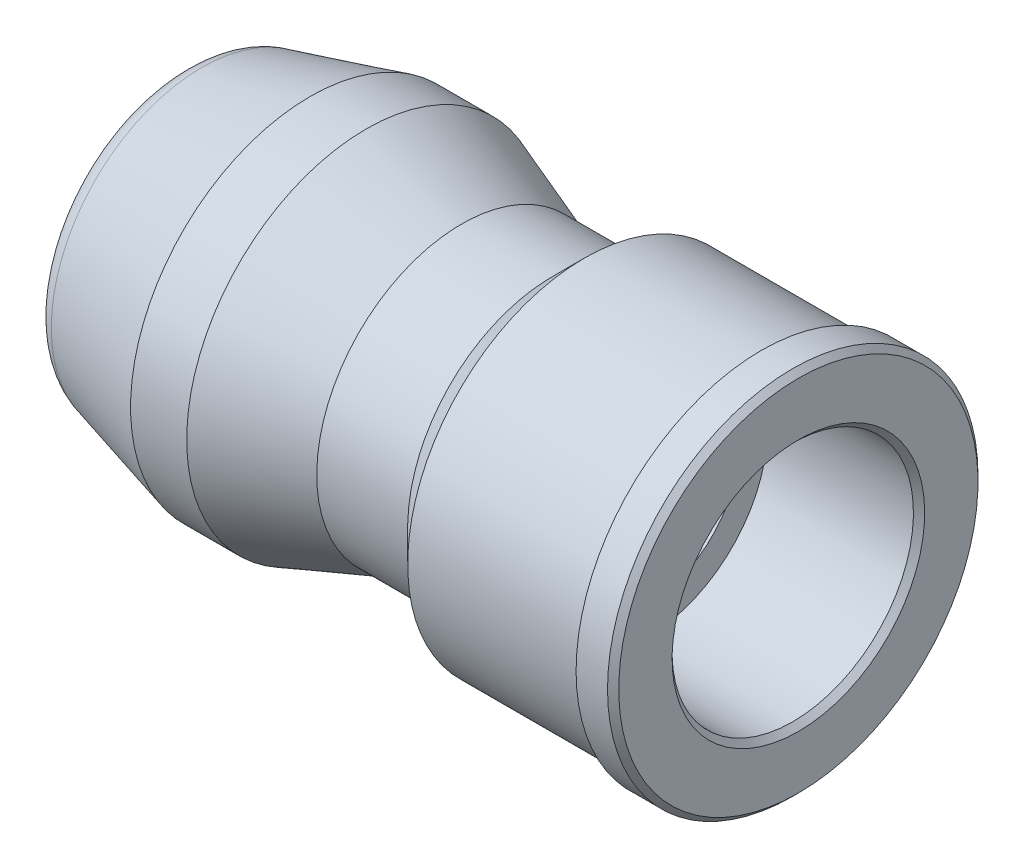
ISO-10303-21;
HEADER;
FILE_DESCRIPTION(('STEP AP214'),'2;1');
FILE_NAME('part.step','',(''),(''),'','','');
FILE_SCHEMA(('AUTOMOTIVE_DESIGN { 1 0 10303 214 1 1 1 1 }'));
ENDSEC;
DATA;
#1=APPLICATION_CONTEXT('core data for automotive mechanical design processes');
#2=APPLICATION_PROTOCOL_DEFINITION('international standard','automotive_design',2000,#1);
#3=PRODUCT_CONTEXT('',#1,'mechanical');
#4=PRODUCT('Part','Part','',(#3));
#5=PRODUCT_RELATED_PRODUCT_CATEGORY('part','',(#4));
#6=PRODUCT_DEFINITION_FORMATION('','',#4);
#7=PRODUCT_DEFINITION_CONTEXT('part definition',#1,'design');
#8=PRODUCT_DEFINITION('design','',#6,#7);
#9=PRODUCT_DEFINITION_SHAPE('','',#8);
#10=(LENGTH_UNIT() NAMED_UNIT(*) SI_UNIT(.MILLI.,.METRE.));
#11=(NAMED_UNIT(*) PLANE_ANGLE_UNIT() SI_UNIT($,.RADIAN.));
#12=(NAMED_UNIT(*) SI_UNIT($,.STERADIAN.) SOLID_ANGLE_UNIT());
#13=UNCERTAINTY_MEASURE_WITH_UNIT(LENGTH_MEASURE(1.E-05),#10,'distance_accuracy_value','');
#14=(GEOMETRIC_REPRESENTATION_CONTEXT(3) GLOBAL_UNCERTAINTY_ASSIGNED_CONTEXT((#13)) GLOBAL_UNIT_ASSIGNED_CONTEXT((#10,
#11,#12)) REPRESENTATION_CONTEXT('',''));
#15=CARTESIAN_POINT('',(0.,0.,0.));
#16=DIRECTION('',(0.,0.,1.));
#17=DIRECTION('',(1.,0.,0.));
#18=AXIS2_PLACEMENT_3D('',#15,#16,#17);
#19=CARTESIAN_POINT('',(0.,0.,0.));
#20=DIRECTION('',(1.,0.,0.));
#21=DIRECTION('',(0.,1.,0.));
#22=AXIS2_PLACEMENT_3D('',#19,#20,#21);
#23=PLANE('',#22);
#24=CARTESIAN_POINT('',(0.,0.,0.));
#25=DIRECTION('',(1.,0.,0.));
#26=DIRECTION('',(0.,1.,0.));
#27=AXIS2_PLACEMENT_3D('',#24,#25,#26);
#28=CIRCLE('',#27,2.19633650601052);
#29=CARTESIAN_POINT('',(0.,2.19633650601052,0.));
#30=VERTEX_POINT('',#29);
#31=EDGE_CURVE('E45',#30,#30,#28,.F.);
#32=ORIENTED_EDGE('',*,*,#31,.T.);
#33=EDGE_LOOP('',(#32));
#34=FACE_BOUND('',#33,.T.);
#35=CARTESIAN_POINT('',(0.,0.,0.));
#36=DIRECTION('',(-1.,0.,0.));
#37=DIRECTION('',(0.,0.,1.));
#38=AXIS2_PLACEMENT_3D('',#35,#36,#37);
#39=CIRCLE('',#38,2.025);
#40=CARTESIAN_POINT('',(0.,0.,2.025));
#41=VERTEX_POINT('',#40);
#42=EDGE_CURVE('E97',#41,#41,#39,.T.);
#43=ORIENTED_EDGE('',*,*,#42,.F.);
#44=EDGE_LOOP('',(#43));
#45=FACE_BOUND('',#44,.T.);
#46=ADVANCED_FACE('F38',(#34,#45),#23,.F.);
#47=CARTESIAN_POINT('',(2.3,0.,0.));
#48=DIRECTION('',(1.,0.,0.));
#49=DIRECTION('',(0.,1.,0.));
#50=AXIS2_PLACEMENT_3D('',#47,#48,#49);
#51=CONICAL_SURFACE('',#50,3.19628314259158,0.261799387799146);
#52=CARTESIAN_POINT('',(0.370590477448743,0.,0.));
#53=DIRECTION('',(-1.,0.,0.));
#54=DIRECTION('',(0.,-1.,0.));
#55=AXIS2_PLACEMENT_3D('',#52,#53,#54);
#56=CIRCLE('',#55,2.67929941915505);
#57=CARTESIAN_POINT('',(0.370590477448743,-2.67929941915505,0.));
#58=VERTEX_POINT('',#57);
#59=EDGE_CURVE('E12',#58,#58,#56,.F.);
#60=ORIENTED_EDGE('',*,*,#59,.T.);
#61=EDGE_LOOP('',(#60));
#62=FACE_BOUND('',#61,.T.);
#63=CARTESIAN_POINT('',(2.3,0.,0.));
#64=DIRECTION('',(-1.,0.,0.));
#65=DIRECTION('',(0.,-1.,0.));
#66=AXIS2_PLACEMENT_3D('',#63,#64,#65);
#67=CIRCLE('',#66,3.19628314259158);
#68=CARTESIAN_POINT('',(2.3,-3.19628314259158,0.));
#69=VERTEX_POINT('',#68);
#70=EDGE_CURVE('E70',#69,#69,#67,.T.);
#71=ORIENTED_EDGE('',*,*,#70,.T.);
#72=EDGE_LOOP('',(#71));
#73=FACE_BOUND('',#72,.T.);
#74=ADVANCED_FACE('F104',(#62,#73),#51,.T.);
#75=CARTESIAN_POINT('',(0.,0.,0.));
#76=DIRECTION('',(-1.,0.,0.));
#77=DIRECTION('',(0.,-1.,0.));
#78=AXIS2_PLACEMENT_3D('',#75,#76,#77);
#79=CYLINDRICAL_SURFACE('',#78,3.19628314259158);
#80=ORIENTED_EDGE('',*,*,#70,.F.);
#81=EDGE_LOOP('',(#80));
#82=FACE_BOUND('',#81,.T.);
#83=CARTESIAN_POINT('',(3.3,0.,0.));
#84=DIRECTION('',(-1.,0.,0.));
#85=DIRECTION('',(0.,-1.,0.));
#86=AXIS2_PLACEMENT_3D('',#83,#84,#85);
#87=CIRCLE('',#86,3.19628314259158);
#88=CARTESIAN_POINT('',(3.3,-3.19628314259158,0.));
#89=VERTEX_POINT('',#88);
#90=EDGE_CURVE('E78',#89,#89,#87,.T.);
#91=ORIENTED_EDGE('',*,*,#90,.T.);
#92=EDGE_LOOP('',(#91));
#93=FACE_BOUND('',#92,.T.);
#94=ADVANCED_FACE('F109',(#82,#93),#79,.T.);
#95=CARTESIAN_POINT('',(5.,0.,0.));
#96=DIRECTION('',(-1.,0.,0.));
#97=DIRECTION('',(0.,-1.,0.));
#98=AXIS2_PLACEMENT_3D('',#95,#96,#97);
#99=CONICAL_SURFACE('',#98,2.58,0.347784219086138);
#100=ORIENTED_EDGE('',*,*,#90,.F.);
#101=EDGE_LOOP('',(#100));
#102=FACE_BOUND('',#101,.T.);
#103=CARTESIAN_POINT('',(5.,0.,0.));
#104=DIRECTION('',(-1.,0.,0.));
#105=DIRECTION('',(0.,-1.,0.));
#106=AXIS2_PLACEMENT_3D('',#103,#104,#105);
#107=CIRCLE('',#106,2.58);
#108=CARTESIAN_POINT('',(5.,-2.58,0.));
#109=VERTEX_POINT('',#108);
#110=EDGE_CURVE('E81',#109,#109,#107,.T.);
#111=ORIENTED_EDGE('',*,*,#110,.T.);
#112=EDGE_LOOP('',(#111));
#113=FACE_BOUND('',#112,.T.);
#114=ADVANCED_FACE('F146',(#102,#113),#99,.T.);
#115=CARTESIAN_POINT('',(0.,0.,0.));
#116=DIRECTION('',(-1.,0.,0.));
#117=DIRECTION('',(0.,-1.,0.));
#118=AXIS2_PLACEMENT_3D('',#115,#116,#117);
#119=CYLINDRICAL_SURFACE('',#118,2.58);
#120=ORIENTED_EDGE('',*,*,#110,.F.);
#121=EDGE_LOOP('',(#120));
#122=FACE_BOUND('',#121,.T.);
#123=CARTESIAN_POINT('',(6.62,0.,0.));
#124=DIRECTION('',(-1.,0.,0.));
#125=DIRECTION('',(0.,-1.,0.));
#126=AXIS2_PLACEMENT_3D('',#123,#124,#125);
#127=CIRCLE('',#126,2.58);
#128=CARTESIAN_POINT('',(6.62,-2.58,0.));
#129=VERTEX_POINT('',#128);
#130=EDGE_CURVE('E84',#129,#129,#127,.T.);
#131=ORIENTED_EDGE('',*,*,#130,.T.);
#132=EDGE_LOOP('',(#131));
#133=FACE_BOUND('',#132,.T.);
#134=ADVANCED_FACE('F140',(#122,#133),#119,.T.);
#135=CARTESIAN_POINT('',(7.19,0.,0.));
#136=DIRECTION('',(1.,0.,0.));
#137=DIRECTION('',(0.,1.,0.));
#138=AXIS2_PLACEMENT_3D('',#135,#136,#137);
#139=CONICAL_SURFACE('',#138,3.15,0.785398163397451);
#140=ORIENTED_EDGE('',*,*,#130,.F.);
#141=EDGE_LOOP('',(#140));
#142=FACE_BOUND('',#141,.T.);
#143=CARTESIAN_POINT('',(7.19,0.,0.));
#144=DIRECTION('',(-1.,0.,0.));
#145=DIRECTION('',(0.,-1.,0.));
#146=AXIS2_PLACEMENT_3D('',#143,#144,#145);
#147=CIRCLE('',#146,3.15);
#148=CARTESIAN_POINT('',(7.19,-3.15,0.));
#149=VERTEX_POINT('',#148);
#150=EDGE_CURVE('E87',#149,#149,#147,.T.);
#151=ORIENTED_EDGE('',*,*,#150,.T.);
#152=EDGE_LOOP('',(#151));
#153=FACE_BOUND('',#152,.T.);
#154=ADVANCED_FACE('F135',(#142,#153),#139,.T.);
#155=CARTESIAN_POINT('',(0.,0.,0.));
#156=DIRECTION('',(-1.,0.,0.));
#157=DIRECTION('',(0.,-1.,0.));
#158=AXIS2_PLACEMENT_3D('',#155,#156,#157);
#159=CYLINDRICAL_SURFACE('',#158,3.15);
#160=CARTESIAN_POINT('',(10.24,0.,0.));
#161=DIRECTION('',(1.,0.,0.));
#162=DIRECTION('',(0.,1.,0.));
#163=AXIS2_PLACEMENT_3D('',#160,#161,#162);
#164=CIRCLE('',#163,3.15);
#165=CARTESIAN_POINT('',(10.24,3.15,0.));
#166=VERTEX_POINT('',#165);
#167=EDGE_CURVE('E53',#166,#166,#164,.F.);
#168=ORIENTED_EDGE('',*,*,#167,.T.);
#169=EDGE_LOOP('',(#168));
#170=FACE_BOUND('',#169,.T.);
#171=ORIENTED_EDGE('',*,*,#150,.F.);
#172=EDGE_LOOP('',(#171));
#173=FACE_BOUND('',#172,.T.);
#174=ADVANCED_FACE('F131',(#170,#173),#159,.T.);
#175=CARTESIAN_POINT('',(10.34,3.15,0.));
#176=DIRECTION('',(1.,0.,0.));
#177=DIRECTION('',(0.,1.,0.));
#178=AXIS2_PLACEMENT_3D('',#175,#176,#177);
#179=PLANE('',#178);
#180=CARTESIAN_POINT('',(10.34,0.,0.));
#181=DIRECTION('',(1.,0.,0.));
#182=DIRECTION('',(0.,1.,0.));
#183=AXIS2_PLACEMENT_3D('',#180,#181,#182);
#184=CIRCLE('',#183,3.25);
#185=CARTESIAN_POINT('',(10.34,3.25,0.));
#186=VERTEX_POINT('',#185);
#187=EDGE_CURVE('E49',#186,#186,#184,.T.);
#188=ORIENTED_EDGE('',*,*,#187,.T.);
#189=EDGE_LOOP('',(#188));
#190=FACE_BOUND('',#189,.T.);
#191=CARTESIAN_POINT('',(10.34,0.,0.));
#192=DIRECTION('',(-1.,0.,0.));
#193=DIRECTION('',(0.,-1.,0.));
#194=AXIS2_PLACEMENT_3D('',#191,#192,#193);
#195=CIRCLE('',#194,3.3);
#196=CARTESIAN_POINT('',(10.34,-3.3,0.));
#197=VERTEX_POINT('',#196);
#198=EDGE_CURVE('E90',#197,#197,#195,.T.);
#199=ORIENTED_EDGE('',*,*,#198,.T.);
#200=EDGE_LOOP('',(#199));
#201=FACE_BOUND('',#200,.T.);
#202=ADVANCED_FACE('F134',(#190,#201),#179,.F.);
#203=CARTESIAN_POINT('',(0.,0.,0.));
#204=DIRECTION('',(-1.,0.,0.));
#205=DIRECTION('',(0.,-1.,0.));
#206=AXIS2_PLACEMENT_3D('',#203,#204,#205);
#207=CYLINDRICAL_SURFACE('',#206,3.3);
#208=CARTESIAN_POINT('',(10.9,0.,0.));
#209=DIRECTION('',(-1.,0.,0.));
#210=DIRECTION('',(0.,-1.,0.));
#211=AXIS2_PLACEMENT_3D('',#208,#209,#210);
#212=CIRCLE('',#211,3.3);
#213=CARTESIAN_POINT('',(10.9,-3.3,0.));
#214=VERTEX_POINT('',#213);
#215=EDGE_CURVE('E58',#214,#214,#212,.T.);
#216=ORIENTED_EDGE('',*,*,#215,.T.);
#217=EDGE_LOOP('',(#216));
#218=FACE_BOUND('',#217,.T.);
#219=ORIENTED_EDGE('',*,*,#198,.F.);
#220=EDGE_LOOP('',(#219));
#221=FACE_BOUND('',#220,.T.);
#222=ADVANCED_FACE('F229',(#218,#221),#207,.T.);
#223=CARTESIAN_POINT('',(11.,3.3,0.));
#224=DIRECTION('',(-1.,0.,0.));
#225=DIRECTION('',(0.,-1.,0.));
#226=AXIS2_PLACEMENT_3D('',#223,#224,#225);
#227=PLANE('',#226);
#228=CARTESIAN_POINT('',(11.,0.,0.));
#229=DIRECTION('',(-1.,0.,0.));
#230=DIRECTION('',(0.,-1.,0.));
#231=AXIS2_PLACEMENT_3D('',#228,#229,#230);
#232=CIRCLE('',#231,2.25);
#233=CARTESIAN_POINT('',(11.,-2.25,0.));
#234=VERTEX_POINT('',#233);
#235=EDGE_CURVE('E64',#234,#234,#232,.T.);
#236=ORIENTED_EDGE('',*,*,#235,.T.);
#237=EDGE_LOOP('',(#236));
#238=FACE_BOUND('',#237,.T.);
#239=CARTESIAN_POINT('',(11.,0.,0.));
#240=DIRECTION('',(-1.,0.,0.));
#241=DIRECTION('',(0.,-1.,0.));
#242=AXIS2_PLACEMENT_3D('',#239,#240,#241);
#243=CIRCLE('',#242,3.2);
#244=CARTESIAN_POINT('',(11.,-3.2,0.));
#245=VERTEX_POINT('',#244);
#246=EDGE_CURVE('E67',#245,#245,#243,.F.);
#247=ORIENTED_EDGE('',*,*,#246,.T.);
#248=EDGE_LOOP('',(#247));
#249=FACE_BOUND('',#248,.T.);
#250=ADVANCED_FACE('F238',(#238,#249),#227,.F.);
#251=CARTESIAN_POINT('',(0.,0.,0.));
#252=DIRECTION('',(-1.,0.,0.));
#253=DIRECTION('',(0.,-1.,0.));
#254=AXIS2_PLACEMENT_3D('',#251,#252,#253);
#255=CYLINDRICAL_SURFACE('',#254,2.15);
#256=CARTESIAN_POINT('',(10.9,0.,0.));
#257=DIRECTION('',(-1.,0.,0.));
#258=DIRECTION('',(0.,-1.,0.));
#259=AXIS2_PLACEMENT_3D('',#256,#257,#258);
#260=CIRCLE('',#259,2.15);
#261=CARTESIAN_POINT('',(10.9,-2.15,0.));
#262=VERTEX_POINT('',#261);
#263=EDGE_CURVE('E61',#262,#262,#260,.F.);
#264=ORIENTED_EDGE('',*,*,#263,.T.);
#265=EDGE_LOOP('',(#264));
#266=FACE_BOUND('',#265,.T.);
#267=CARTESIAN_POINT('',(8.3,0.,0.));
#268=DIRECTION('',(-1.,0.,0.));
#269=DIRECTION('',(0.,-1.,0.));
#270=AXIS2_PLACEMENT_3D('',#267,#268,#269);
#271=CIRCLE('',#270,2.15);
#272=CARTESIAN_POINT('',(8.3,-2.15,0.));
#273=VERTEX_POINT('',#272);
#274=EDGE_CURVE('E74',#273,#273,#271,.T.);
#275=ORIENTED_EDGE('',*,*,#274,.T.);
#276=EDGE_LOOP('',(#275));
#277=FACE_BOUND('',#276,.T.);
#278=ADVANCED_FACE('F191',(#266,#277),#255,.F.);
#279=CARTESIAN_POINT('',(8.3,2.15,0.));
#280=DIRECTION('',(-1.,0.,0.));
#281=DIRECTION('',(0.,-1.,0.));
#282=AXIS2_PLACEMENT_3D('',#279,#280,#281);
#283=PLANE('',#282);
#284=CARTESIAN_POINT('',(8.3,0.,0.));
#285=DIRECTION('',(-1.,0.,0.));
#286=DIRECTION('',(0.,-1.,0.));
#287=AXIS2_PLACEMENT_3D('',#284,#285,#286);
#288=CIRCLE('',#287,1.65);
#289=CARTESIAN_POINT('',(8.3,-1.65,0.));
#290=VERTEX_POINT('',#289);
#291=EDGE_CURVE('E71',#290,#290,#288,.T.);
#292=ORIENTED_EDGE('',*,*,#291,.T.);
#293=EDGE_LOOP('',(#292));
#294=FACE_BOUND('',#293,.T.);
#295=ORIENTED_EDGE('',*,*,#274,.F.);
#296=EDGE_LOOP('',(#295));
#297=FACE_BOUND('',#296,.T.);
#298=ADVANCED_FACE('F185',(#294,#297),#283,.F.);
#299=CARTESIAN_POINT('',(0.,0.,0.));
#300=DIRECTION('',(-1.,0.,0.));
#301=DIRECTION('',(0.,0.,1.));
#302=AXIS2_PLACEMENT_3D('',#299,#300,#301);
#303=CYLINDRICAL_SURFACE('',#302,1.65);
#304=CARTESIAN_POINT('',(0.905330085889911,0.,0.));
#305=DIRECTION('',(-1.,0.,0.));
#306=DIRECTION('',(0.,0.,1.));
#307=AXIS2_PLACEMENT_3D('',#304,#305,#306);
#308=CIRCLE('',#307,1.65);
#309=CARTESIAN_POINT('',(0.905330085889911,0.,1.65));
#310=VERTEX_POINT('',#309);
#311=EDGE_CURVE('E75',#310,#310,#308,.T.);
#312=ORIENTED_EDGE('',*,*,#311,.T.);
#313=EDGE_LOOP('',(#312));
#314=FACE_BOUND('',#313,.T.);
#315=ORIENTED_EDGE('',*,*,#291,.F.);
#316=EDGE_LOOP('',(#315));
#317=FACE_BOUND('',#316,.T.);
#318=ADVANCED_FACE('F190',(#314,#317),#303,.F.);
#319=CARTESIAN_POINT('',(0.,0.,0.));
#320=DIRECTION('',(-1.,0.,0.));
#321=DIRECTION('',(0.,0.,1.));
#322=AXIS2_PLACEMENT_3D('',#319,#320,#321);
#323=CONICAL_SURFACE('',#322,2.025,0.392699081698724);
#324=ORIENTED_EDGE('',*,*,#311,.F.);
#325=EDGE_LOOP('',(#324));
#326=FACE_BOUND('',#325,.T.);
#327=ORIENTED_EDGE('',*,*,#42,.T.);
#328=EDGE_LOOP('',(#327));
#329=FACE_BOUND('',#328,.T.);
#330=ADVANCED_FACE('F101',(#326,#329),#323,.F.);
#331=CARTESIAN_POINT('',(11.,0.,0.));
#332=DIRECTION('',(1.,0.,0.));
#333=DIRECTION('',(0.,1.,0.));
#334=AXIS2_PLACEMENT_3D('',#331,#332,#333);
#335=CONICAL_SURFACE('',#334,2.25,0.78539816339745);
#336=ORIENTED_EDGE('',*,*,#263,.F.);
#337=EDGE_LOOP('',(#336));
#338=FACE_BOUND('',#337,.T.);
#339=ORIENTED_EDGE('',*,*,#235,.F.);
#340=EDGE_LOOP('',(#339));
#341=FACE_BOUND('',#340,.T.);
#342=ADVANCED_FACE('F113',(#338,#341),#335,.F.);
#343=CARTESIAN_POINT('',(10.9,0.,0.));
#344=DIRECTION('',(-1.,0.,0.));
#345=DIRECTION('',(0.,-1.,0.));
#346=AXIS2_PLACEMENT_3D('',#343,#344,#345);
#347=CONICAL_SURFACE('',#346,3.3,0.78539816339745);
#348=ORIENTED_EDGE('',*,*,#246,.F.);
#349=EDGE_LOOP('',(#348));
#350=FACE_BOUND('',#349,.T.);
#351=ORIENTED_EDGE('',*,*,#215,.F.);
#352=EDGE_LOOP('',(#351));
#353=FACE_BOUND('',#352,.T.);
#354=ADVANCED_FACE('F116',(#350,#353),#347,.T.);
#355=CARTESIAN_POINT('',(10.24,0.,0.));
#356=DIRECTION('',(1.,0.,0.));
#357=DIRECTION('',(0.,1.,0.));
#358=AXIS2_PLACEMENT_3D('',#355,#356,#357);
#359=CONICAL_SURFACE('',#358,3.15,0.78539816339745);
#360=ORIENTED_EDGE('',*,*,#187,.F.);
#361=EDGE_LOOP('',(#360));
#362=FACE_BOUND('',#361,.T.);
#363=ORIENTED_EDGE('',*,*,#167,.F.);
#364=EDGE_LOOP('',(#363));
#365=FACE_BOUND('',#364,.T.);
#366=ADVANCED_FACE('F119',(#362,#365),#359,.T.);
#367=CARTESIAN_POINT('',(0.5,0.,0.));
#368=DIRECTION('',(1.,0.,0.));
#369=DIRECTION('',(0.,1.,0.));
#370=AXIS2_PLACEMENT_3D('',#367,#368,#369);
#371=TOROIDAL_SURFACE('',#370,2.19633650601052,0.5);
#372=ORIENTED_EDGE('',*,*,#59,.F.);
#373=EDGE_LOOP('',(#372));
#374=FACE_BOUND('',#373,.T.);
#375=ORIENTED_EDGE('',*,*,#31,.F.);
#376=EDGE_LOOP('',(#375));
#377=FACE_BOUND('',#376,.T.);
#378=ADVANCED_FACE('F40',(#374,#377),#371,.T.);
#379=CLOSED_SHELL('',(#46,#74,#94,#114,#134,#154,#174,#202,#222,#250,#278,#298,#318,#330,#342,
#354,#366,#378));
#380=MANIFOLD_SOLID_BREP('B2',#379);
#381=ADVANCED_BREP_SHAPE_REPRESENTATION('',(#18,#380),#14);
#382=SHAPE_DEFINITION_REPRESENTATION(#9,#381);
ENDSEC;
END-ISO-10303-21;
